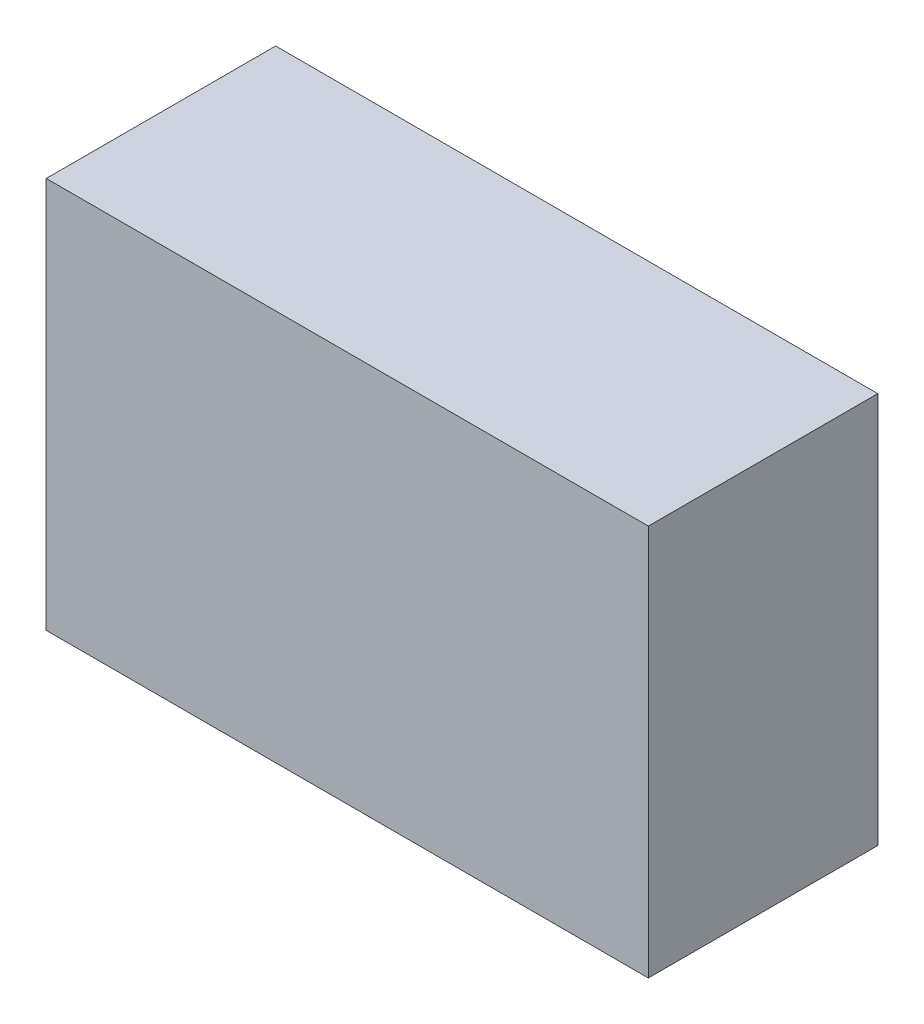
ISO-10303-21;
HEADER;
FILE_DESCRIPTION(('STEP AP214'),'2;1');
FILE_NAME('part.step','',(''),(''),'','','');
FILE_SCHEMA(('AUTOMOTIVE_DESIGN { 1 0 10303 214 1 1 1 1 }'));
ENDSEC;
DATA;
#1=APPLICATION_CONTEXT('core data for automotive mechanical design processes');
#2=APPLICATION_PROTOCOL_DEFINITION('international standard','automotive_design',2000,#1);
#3=PRODUCT_CONTEXT('',#1,'mechanical');
#4=PRODUCT('Part','Part','',(#3));
#5=PRODUCT_RELATED_PRODUCT_CATEGORY('part','',(#4));
#6=PRODUCT_DEFINITION_FORMATION('','',#4);
#7=PRODUCT_DEFINITION_CONTEXT('part definition',#1,'design');
#8=PRODUCT_DEFINITION('design','',#6,#7);
#9=PRODUCT_DEFINITION_SHAPE('','',#8);
#10=(LENGTH_UNIT() NAMED_UNIT(*) SI_UNIT(.MILLI.,.METRE.));
#11=(NAMED_UNIT(*) PLANE_ANGLE_UNIT() SI_UNIT($,.RADIAN.));
#12=(NAMED_UNIT(*) SI_UNIT($,.STERADIAN.) SOLID_ANGLE_UNIT());
#13=UNCERTAINTY_MEASURE_WITH_UNIT(LENGTH_MEASURE(1.E-05),#10,'distance_accuracy_value','');
#14=(GEOMETRIC_REPRESENTATION_CONTEXT(3) GLOBAL_UNCERTAINTY_ASSIGNED_CONTEXT((#13)) GLOBAL_UNIT_ASSIGNED_CONTEXT((#10,
#11,#12)) REPRESENTATION_CONTEXT('',''));
#15=CARTESIAN_POINT('',(0.,0.,0.));
#16=DIRECTION('',(0.,0.,1.));
#17=DIRECTION('',(1.,0.,0.));
#18=AXIS2_PLACEMENT_3D('',#15,#16,#17);
#19=CARTESIAN_POINT('',(-1.,-0.650012700025,0.762001524003));
#20=DIRECTION('',(0.,0.,1.));
#21=DIRECTION('',(1.,0.,0.));
#22=AXIS2_PLACEMENT_3D('',#19,#20,#21);
#23=PLANE('',#22);
#24=DIRECTION('',(0.,-1.,0.));
#25=VECTOR('',#24,1.);
#26=CARTESIAN_POINT('',(1.,-1.27000250000156E-05,0.762001524003));
#27=LINE('',#26,#25);
#28=CARTESIAN_POINT('',(1.,0.649987299975,0.762001524003));
#29=VERTEX_POINT('',#28);
#30=CARTESIAN_POINT('',(1.,-0.650012700025,0.762001524003));
#31=VERTEX_POINT('',#30);
#32=EDGE_CURVE('E77',#29,#31,#27,.T.);
#33=ORIENTED_EDGE('',*,*,#32,.F.);
#34=DIRECTION('',(1.,0.,0.));
#35=VECTOR('',#34,1.);
#36=CARTESIAN_POINT('',(0.,0.649987299975,0.762001524003));
#37=LINE('',#36,#35);
#38=CARTESIAN_POINT('',(-1.,0.649987299975,0.762001524003));
#39=VERTEX_POINT('',#38);
#40=EDGE_CURVE('E59',#39,#29,#37,.T.);
#41=ORIENTED_EDGE('',*,*,#40,.F.);
#42=DIRECTION('',(0.,-1.,0.));
#43=VECTOR('',#42,1.);
#44=CARTESIAN_POINT('',(-1.,-1.27000250000156E-05,0.762001524003));
#45=LINE('',#44,#43);
#46=CARTESIAN_POINT('',(-1.,-0.650012700025,0.762001524003));
#47=VERTEX_POINT('',#46);
#48=EDGE_CURVE('E21',#39,#47,#45,.T.);
#49=ORIENTED_EDGE('',*,*,#48,.T.);
#50=DIRECTION('',(1.,0.,0.));
#51=VECTOR('',#50,1.);
#52=CARTESIAN_POINT('',(0.,-0.650012700025,0.762001524003));
#53=LINE('',#52,#51);
#54=EDGE_CURVE('E56',#47,#31,#53,.T.);
#55=ORIENTED_EDGE('',*,*,#54,.T.);
#56=EDGE_LOOP('',(#33,#41,#49,#55));
#57=FACE_BOUND('',#56,.T.);
#58=ADVANCED_FACE('F17',(#57),#23,.T.);
#59=CARTESIAN_POINT('',(-1.,0.649987299975,0.));
#60=DIRECTION('',(1.,0.,0.));
#61=DIRECTION('',(0.,0.,1.));
#62=AXIS2_PLACEMENT_3D('',#59,#60,#61);
#63=PLANE('',#62);
#64=DIRECTION('',(0.,0.,1.));
#65=VECTOR('',#64,1.);
#66=CARTESIAN_POINT('',(-1.,0.649987299975,0.3810007620015));
#67=LINE('',#66,#65);
#68=CARTESIAN_POINT('',(-1.,0.649987299975,0.));
#69=VERTEX_POINT('',#68);
#70=EDGE_CURVE('E79',#69,#39,#67,.T.);
#71=ORIENTED_EDGE('',*,*,#70,.F.);
#72=DIRECTION('',(0.,-1.,0.));
#73=VECTOR('',#72,1.);
#74=CARTESIAN_POINT('',(-1.,-1.27000250000156E-05,0.));
#75=LINE('',#74,#73);
#76=CARTESIAN_POINT('',(-1.,-0.650012700025,0.));
#77=VERTEX_POINT('',#76);
#78=EDGE_CURVE('E74',#69,#77,#75,.T.);
#79=ORIENTED_EDGE('',*,*,#78,.T.);
#80=DIRECTION('',(0.,0.,1.));
#81=VECTOR('',#80,1.);
#82=CARTESIAN_POINT('',(-1.,-0.650012700025,0.3810007620015));
#83=LINE('',#82,#81);
#84=EDGE_CURVE('E64',#77,#47,#83,.T.);
#85=ORIENTED_EDGE('',*,*,#84,.T.);
#86=ORIENTED_EDGE('',*,*,#48,.F.);
#87=EDGE_LOOP('',(#71,#79,#85,#86));
#88=FACE_BOUND('',#87,.T.);
#89=ADVANCED_FACE('F73',(#88),#63,.F.);
#90=CARTESIAN_POINT('',(-1.,-0.650012700025,0.));
#91=DIRECTION('',(0.,1.,0.));
#92=DIRECTION('',(0.,0.,1.));
#93=AXIS2_PLACEMENT_3D('',#90,#91,#92);
#94=PLANE('',#93);
#95=ORIENTED_EDGE('',*,*,#54,.F.);
#96=ORIENTED_EDGE('',*,*,#84,.F.);
#97=DIRECTION('',(1.,0.,0.));
#98=VECTOR('',#97,1.);
#99=CARTESIAN_POINT('',(0.,-0.650012700025,0.));
#100=LINE('',#99,#98);
#101=CARTESIAN_POINT('',(1.,-0.650012700025,0.));
#102=VERTEX_POINT('',#101);
#103=EDGE_CURVE('E84',#77,#102,#100,.T.);
#104=ORIENTED_EDGE('',*,*,#103,.T.);
#105=DIRECTION('',(0.,0.,-1.));
#106=VECTOR('',#105,1.);
#107=CARTESIAN_POINT('',(1.,-0.650012700025,0.3810007620015));
#108=LINE('',#107,#106);
#109=EDGE_CURVE('E70',#31,#102,#108,.T.);
#110=ORIENTED_EDGE('',*,*,#109,.F.);
#111=EDGE_LOOP('',(#95,#96,#104,#110));
#112=FACE_BOUND('',#111,.T.);
#113=ADVANCED_FACE('F67',(#112),#94,.F.);
#114=CARTESIAN_POINT('',(1.,0.649987299975,0.));
#115=DIRECTION('',(1.,0.,0.));
#116=DIRECTION('',(0.,0.,1.));
#117=AXIS2_PLACEMENT_3D('',#114,#115,#116);
#118=PLANE('',#117);
#119=DIRECTION('',(0.,0.,-1.));
#120=VECTOR('',#119,1.);
#121=CARTESIAN_POINT('',(1.,0.649987299975,0.3810007620015));
#122=LINE('',#121,#120);
#123=CARTESIAN_POINT('',(1.,0.649987299975,0.));
#124=VERTEX_POINT('',#123);
#125=EDGE_CURVE('E35',#29,#124,#122,.T.);
#126=ORIENTED_EDGE('',*,*,#125,.F.);
#127=ORIENTED_EDGE('',*,*,#32,.T.);
#128=ORIENTED_EDGE('',*,*,#109,.T.);
#129=DIRECTION('',(0.,1.,0.));
#130=VECTOR('',#129,1.);
#131=CARTESIAN_POINT('',(1.,-1.27000250000156E-05,0.));
#132=LINE('',#131,#130);
#133=EDGE_CURVE('E27',#102,#124,#132,.T.);
#134=ORIENTED_EDGE('',*,*,#133,.T.);
#135=EDGE_LOOP('',(#126,#127,#128,#134));
#136=FACE_BOUND('',#135,.T.);
#137=ADVANCED_FACE('F89',(#136),#118,.T.);
#138=CARTESIAN_POINT('',(-1.,0.649987299975,0.));
#139=DIRECTION('',(0.,1.,0.));
#140=DIRECTION('',(0.,0.,1.));
#141=AXIS2_PLACEMENT_3D('',#138,#139,#140);
#142=PLANE('',#141);
#143=ORIENTED_EDGE('',*,*,#40,.T.);
#144=ORIENTED_EDGE('',*,*,#125,.T.);
#145=DIRECTION('',(-1.,0.,0.));
#146=VECTOR('',#145,1.);
#147=CARTESIAN_POINT('',(0.,0.649987299975,0.));
#148=LINE('',#147,#146);
#149=EDGE_CURVE('E11',#124,#69,#148,.T.);
#150=ORIENTED_EDGE('',*,*,#149,.T.);
#151=ORIENTED_EDGE('',*,*,#70,.T.);
#152=EDGE_LOOP('',(#143,#144,#150,#151));
#153=FACE_BOUND('',#152,.T.);
#154=ADVANCED_FACE('F91',(#153),#142,.T.);
#155=CARTESIAN_POINT('',(-1.,-0.650012700025,0.));
#156=DIRECTION('',(0.,0.,1.));
#157=DIRECTION('',(1.,0.,0.));
#158=AXIS2_PLACEMENT_3D('',#155,#156,#157);
#159=PLANE('',#158);
#160=ORIENTED_EDGE('',*,*,#133,.F.);
#161=ORIENTED_EDGE('',*,*,#103,.F.);
#162=ORIENTED_EDGE('',*,*,#78,.F.);
#163=ORIENTED_EDGE('',*,*,#149,.F.);
#164=EDGE_LOOP('',(#160,#161,#162,#163));
#165=FACE_BOUND('',#164,.T.);
#166=ADVANCED_FACE('F19',(#165),#159,.F.);
#167=CLOSED_SHELL('',(#58,#89,#113,#137,#154,#166));
#168=MANIFOLD_SOLID_BREP('B1',#167);
#169=ADVANCED_BREP_SHAPE_REPRESENTATION('',(#18,#168),#14);
#170=SHAPE_DEFINITION_REPRESENTATION(#9,#169);
ENDSEC;
END-ISO-10303-21;
